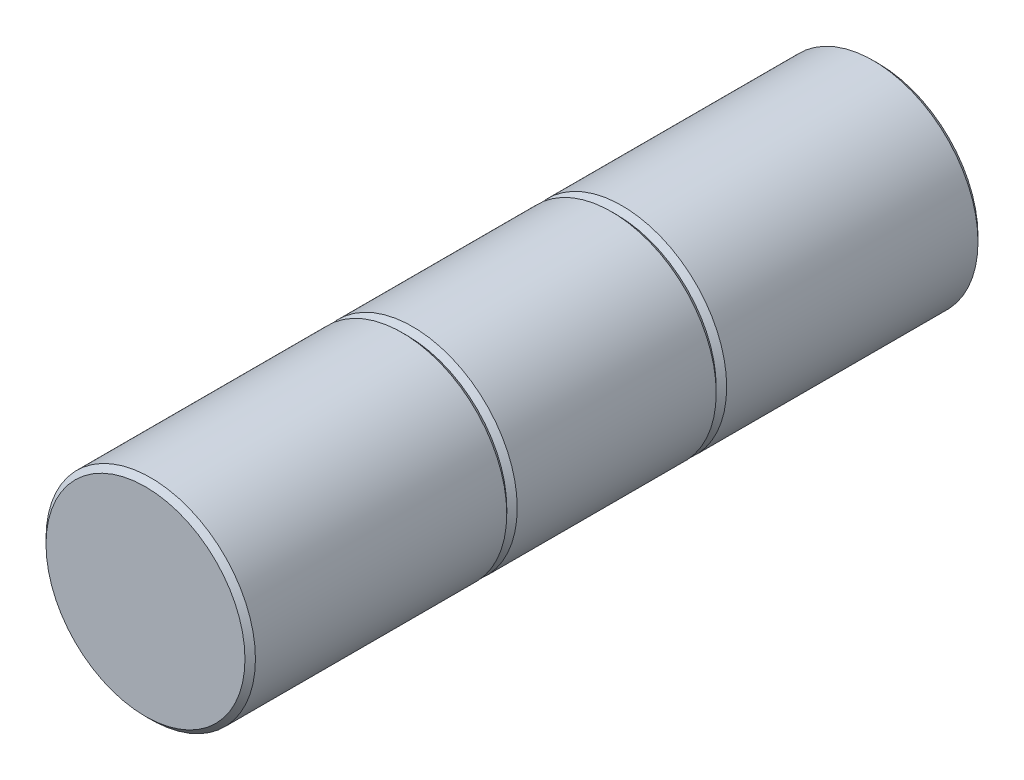
ISO-10303-21;
HEADER;
FILE_DESCRIPTION(('STEP AP214'),'2;1');
FILE_NAME('part.step','',(''),(''),'','','');
FILE_SCHEMA(('AUTOMOTIVE_DESIGN { 1 0 10303 214 1 1 1 1 }'));
ENDSEC;
DATA;
#1=APPLICATION_CONTEXT('core data for automotive mechanical design processes');
#2=APPLICATION_PROTOCOL_DEFINITION('international standard','automotive_design',2000,#1);
#3=PRODUCT_CONTEXT('',#1,'mechanical');
#4=PRODUCT('Part','Part','',(#3));
#5=PRODUCT_RELATED_PRODUCT_CATEGORY('part','',(#4));
#6=PRODUCT_DEFINITION_FORMATION('','',#4);
#7=PRODUCT_DEFINITION_CONTEXT('part definition',#1,'design');
#8=PRODUCT_DEFINITION('design','',#6,#7);
#9=PRODUCT_DEFINITION_SHAPE('','',#8);
#10=(LENGTH_UNIT() NAMED_UNIT(*) SI_UNIT(.MILLI.,.METRE.));
#11=(NAMED_UNIT(*) PLANE_ANGLE_UNIT() SI_UNIT($,.RADIAN.));
#12=(NAMED_UNIT(*) SI_UNIT($,.STERADIAN.) SOLID_ANGLE_UNIT());
#13=UNCERTAINTY_MEASURE_WITH_UNIT(LENGTH_MEASURE(1.E-05),#10,'distance_accuracy_value','');
#14=(GEOMETRIC_REPRESENTATION_CONTEXT(3) GLOBAL_UNCERTAINTY_ASSIGNED_CONTEXT((#13)) GLOBAL_UNIT_ASSIGNED_CONTEXT((#10,
#11,#12)) REPRESENTATION_CONTEXT('',''));
#15=CARTESIAN_POINT('',(0.,0.,0.));
#16=DIRECTION('',(0.,0.,1.));
#17=DIRECTION('',(1.,0.,0.));
#18=AXIS2_PLACEMENT_3D('',#15,#16,#17);
#19=CARTESIAN_POINT('',(0.,0.,-7.));
#20=DIRECTION('',(0.,0.,1.));
#21=DIRECTION('',(1.,0.,0.));
#22=AXIS2_PLACEMENT_3D('',#19,#20,#21);
#23=CYLINDRICAL_SURFACE('',#22,2.);
#24=CARTESIAN_POINT('',(0.,0.,-2.1));
#25=DIRECTION('',(0.,0.,-1.));
#26=DIRECTION('',(-1.,0.,0.));
#27=AXIS2_PLACEMENT_3D('',#24,#25,#26);
#28=CIRCLE('',#27,2.);
#29=CARTESIAN_POINT('',(-2.,0.,-2.1));
#30=VERTEX_POINT('',#29);
#31=EDGE_CURVE('E66',#30,#30,#28,.T.);
#32=ORIENTED_EDGE('',*,*,#31,.T.);
#33=EDGE_LOOP('',(#32));
#34=FACE_BOUND('',#33,.T.);
#35=CARTESIAN_POINT('',(0.,0.,-6.9));
#36=DIRECTION('',(0.,0.,-1.));
#37=DIRECTION('',(-1.,0.,0.));
#38=AXIS2_PLACEMENT_3D('',#35,#36,#37);
#39=CIRCLE('',#38,2.);
#40=CARTESIAN_POINT('',(-2.,0.,-6.9));
#41=VERTEX_POINT('',#40);
#42=EDGE_CURVE('E71',#41,#41,#39,.F.);
#43=ORIENTED_EDGE('',*,*,#42,.T.);
#44=EDGE_LOOP('',(#43));
#45=FACE_BOUND('',#44,.T.);
#46=ADVANCED_FACE('F52',(#34,#45),#23,.T.);
#47=CARTESIAN_POINT('',(0.,0.,-7.));
#48=DIRECTION('',(0.,0.,-1.));
#49=DIRECTION('',(-1.,0.,0.));
#50=AXIS2_PLACEMENT_3D('',#47,#48,#49);
#51=PLANE('',#50);
#52=CARTESIAN_POINT('',(0.,0.,-7.));
#53=DIRECTION('',(0.,0.,-1.));
#54=DIRECTION('',(-1.,0.,0.));
#55=AXIS2_PLACEMENT_3D('',#52,#53,#54);
#56=CIRCLE('',#55,1.9);
#57=CARTESIAN_POINT('',(-1.9,0.,-7.));
#58=VERTEX_POINT('',#57);
#59=EDGE_CURVE('E11',#58,#58,#56,.T.);
#60=ORIENTED_EDGE('',*,*,#59,.T.);
#61=EDGE_LOOP('',(#60));
#62=FACE_BOUND('',#61,.T.);
#63=ADVANCED_FACE('F88',(#62),#51,.T.);
#64=CARTESIAN_POINT('',(0.,0.,-2.));
#65=DIRECTION('',(0.,0.,-1.));
#66=DIRECTION('',(-1.,0.,0.));
#67=AXIS2_PLACEMENT_3D('',#64,#65,#66);
#68=PLANE('',#67);
#69=CARTESIAN_POINT('',(0.,0.,-2.));
#70=DIRECTION('',(0.,0.,-1.));
#71=DIRECTION('',(-1.,0.,0.));
#72=AXIS2_PLACEMENT_3D('',#69,#70,#71);
#73=CIRCLE('',#72,1.9);
#74=CARTESIAN_POINT('',(-1.9,0.,-2.));
#75=VERTEX_POINT('',#74);
#76=EDGE_CURVE('E61',#75,#75,#73,.F.);
#77=ORIENTED_EDGE('',*,*,#76,.T.);
#78=EDGE_LOOP('',(#77));
#79=FACE_BOUND('',#78,.T.);
#80=ADVANCED_FACE('F85',(#79),#68,.F.);
#81=CARTESIAN_POINT('',(0.,0.,-2.1));
#82=DIRECTION('',(0.,0.,-1.));
#83=DIRECTION('',(-1.,0.,0.));
#84=AXIS2_PLACEMENT_3D('',#81,#82,#83);
#85=CONICAL_SURFACE('',#84,2.,0.785398163397453);
#86=ORIENTED_EDGE('',*,*,#76,.F.);
#87=EDGE_LOOP('',(#86));
#88=FACE_BOUND('',#87,.T.);
#89=ORIENTED_EDGE('',*,*,#31,.F.);
#90=EDGE_LOOP('',(#89));
#91=FACE_BOUND('',#90,.T.);
#92=ADVANCED_FACE('F81',(#88,#91),#85,.T.);
#93=CARTESIAN_POINT('',(0.,0.,-7.));
#94=DIRECTION('',(0.,0.,1.));
#95=DIRECTION('',(1.,0.,0.));
#96=AXIS2_PLACEMENT_3D('',#93,#94,#95);
#97=CONICAL_SURFACE('',#96,1.9,0.785398163397444);
#98=ORIENTED_EDGE('',*,*,#42,.F.);
#99=EDGE_LOOP('',(#98));
#100=FACE_BOUND('',#99,.T.);
#101=ORIENTED_EDGE('',*,*,#59,.F.);
#102=EDGE_LOOP('',(#101));
#103=FACE_BOUND('',#102,.T.);
#104=ADVANCED_FACE('F55',(#100,#103),#97,.T.);
#105=CLOSED_SHELL('',(#46,#63,#80,#92,#104));
#106=MANIFOLD_SOLID_BREP('B2',#105);
#107=CARTESIAN_POINT('',(0.,0.,7.));
#108=DIRECTION('',(0.,0.,-1.));
#109=DIRECTION('',(-1.,0.,0.));
#110=AXIS2_PLACEMENT_3D('',#107,#108,#109);
#111=CYLINDRICAL_SURFACE('',#110,2.);
#112=CARTESIAN_POINT('',(0.,0.,2.1));
#113=DIRECTION('',(0.,0.,1.));
#114=DIRECTION('',(1.,0.,0.));
#115=AXIS2_PLACEMENT_3D('',#112,#113,#114);
#116=CIRCLE('',#115,2.);
#117=CARTESIAN_POINT('',(2.,0.,2.1));
#118=VERTEX_POINT('',#117);
#119=EDGE_CURVE('E162',#118,#118,#116,.T.);
#120=ORIENTED_EDGE('',*,*,#119,.T.);
#121=EDGE_LOOP('',(#120));
#122=FACE_BOUND('',#121,.T.);
#123=CARTESIAN_POINT('',(0.,0.,6.9));
#124=DIRECTION('',(0.,0.,1.));
#125=DIRECTION('',(1.,0.,0.));
#126=AXIS2_PLACEMENT_3D('',#123,#124,#125);
#127=CIRCLE('',#126,2.);
#128=CARTESIAN_POINT('',(2.,0.,6.9));
#129=VERTEX_POINT('',#128);
#130=EDGE_CURVE('E166',#129,#129,#127,.F.);
#131=ORIENTED_EDGE('',*,*,#130,.T.);
#132=EDGE_LOOP('',(#131));
#133=FACE_BOUND('',#132,.T.);
#134=ADVANCED_FACE('F150',(#122,#133),#111,.T.);
#135=CARTESIAN_POINT('',(0.,0.,7.));
#136=DIRECTION('',(0.,0.,1.));
#137=DIRECTION('',(1.,0.,0.));
#138=AXIS2_PLACEMENT_3D('',#135,#136,#137);
#139=PLANE('',#138);
#140=CARTESIAN_POINT('',(0.,0.,7.));
#141=DIRECTION('',(0.,0.,1.));
#142=DIRECTION('',(1.,0.,0.));
#143=AXIS2_PLACEMENT_3D('',#140,#141,#142);
#144=CIRCLE('',#143,1.9);
#145=CARTESIAN_POINT('',(1.9,0.,7.));
#146=VERTEX_POINT('',#145);
#147=EDGE_CURVE('E51',#146,#146,#144,.T.);
#148=ORIENTED_EDGE('',*,*,#147,.T.);
#149=EDGE_LOOP('',(#148));
#150=FACE_BOUND('',#149,.T.);
#151=ADVANCED_FACE('F182',(#150),#139,.T.);
#152=CARTESIAN_POINT('',(0.,0.,2.));
#153=DIRECTION('',(0.,0.,1.));
#154=DIRECTION('',(1.,0.,0.));
#155=AXIS2_PLACEMENT_3D('',#152,#153,#154);
#156=PLANE('',#155);
#157=CARTESIAN_POINT('',(0.,0.,2.));
#158=DIRECTION('',(0.,0.,1.));
#159=DIRECTION('',(1.,0.,0.));
#160=AXIS2_PLACEMENT_3D('',#157,#158,#159);
#161=CIRCLE('',#160,1.9);
#162=CARTESIAN_POINT('',(1.9,0.,2.));
#163=VERTEX_POINT('',#162);
#164=EDGE_CURVE('E158',#163,#163,#161,.F.);
#165=ORIENTED_EDGE('',*,*,#164,.T.);
#166=EDGE_LOOP('',(#165));
#167=FACE_BOUND('',#166,.T.);
#168=ADVANCED_FACE('F179',(#167),#156,.F.);
#169=CARTESIAN_POINT('',(0.,0.,2.1));
#170=DIRECTION('',(0.,0.,1.));
#171=DIRECTION('',(1.,0.,0.));
#172=AXIS2_PLACEMENT_3D('',#169,#170,#171);
#173=CONICAL_SURFACE('',#172,2.,0.785398163397453);
#174=ORIENTED_EDGE('',*,*,#164,.F.);
#175=EDGE_LOOP('',(#174));
#176=FACE_BOUND('',#175,.T.);
#177=ORIENTED_EDGE('',*,*,#119,.F.);
#178=EDGE_LOOP('',(#177));
#179=FACE_BOUND('',#178,.T.);
#180=ADVANCED_FACE('F175',(#176,#179),#173,.T.);
#181=CARTESIAN_POINT('',(0.,0.,7.));
#182=DIRECTION('',(0.,0.,-1.));
#183=DIRECTION('',(-1.,0.,0.));
#184=AXIS2_PLACEMENT_3D('',#181,#182,#183);
#185=CONICAL_SURFACE('',#184,1.9,0.785398163397444);
#186=ORIENTED_EDGE('',*,*,#130,.F.);
#187=EDGE_LOOP('',(#186));
#188=FACE_BOUND('',#187,.T.);
#189=ORIENTED_EDGE('',*,*,#147,.F.);
#190=EDGE_LOOP('',(#189));
#191=FACE_BOUND('',#190,.T.);
#192=ADVANCED_FACE('F153',(#188,#191),#185,.T.);
#193=CLOSED_SHELL('',(#134,#151,#168,#180,#192));
#194=MANIFOLD_SOLID_BREP('B6',#193);
#195=CARTESIAN_POINT('',(0.,0.,2.));
#196=DIRECTION('',(0.,0.,-1.));
#197=DIRECTION('',(-1.,0.,0.));
#198=AXIS2_PLACEMENT_3D('',#195,#196,#197);
#199=CYLINDRICAL_SURFACE('',#198,2.);
#200=CARTESIAN_POINT('',(0.,0.,-1.9));
#201=DIRECTION('',(0.,0.,1.));
#202=DIRECTION('',(1.,0.,0.));
#203=AXIS2_PLACEMENT_3D('',#200,#201,#202);
#204=CIRCLE('',#203,2.);
#205=CARTESIAN_POINT('',(2.,0.,-1.9));
#206=VERTEX_POINT('',#205);
#207=EDGE_CURVE('E249',#206,#206,#204,.T.);
#208=ORIENTED_EDGE('',*,*,#207,.T.);
#209=EDGE_LOOP('',(#208));
#210=FACE_BOUND('',#209,.T.);
#211=CARTESIAN_POINT('',(0.,0.,1.9));
#212=DIRECTION('',(0.,0.,1.));
#213=DIRECTION('',(1.,0.,0.));
#214=AXIS2_PLACEMENT_3D('',#211,#212,#213);
#215=CIRCLE('',#214,2.);
#216=CARTESIAN_POINT('',(2.,0.,1.9));
#217=VERTEX_POINT('',#216);
#218=EDGE_CURVE('E253',#217,#217,#215,.F.);
#219=ORIENTED_EDGE('',*,*,#218,.T.);
#220=EDGE_LOOP('',(#219));
#221=FACE_BOUND('',#220,.T.);
#222=ADVANCED_FACE('F237',(#210,#221),#199,.T.);
#223=CARTESIAN_POINT('',(0.,0.,2.));
#224=DIRECTION('',(0.,0.,1.));
#225=DIRECTION('',(1.,0.,0.));
#226=AXIS2_PLACEMENT_3D('',#223,#224,#225);
#227=PLANE('',#226);
#228=CARTESIAN_POINT('',(0.,0.,2.));
#229=DIRECTION('',(0.,0.,1.));
#230=DIRECTION('',(1.,0.,0.));
#231=AXIS2_PLACEMENT_3D('',#228,#229,#230);
#232=CIRCLE('',#231,1.9);
#233=CARTESIAN_POINT('',(1.9,0.,2.));
#234=VERTEX_POINT('',#233);
#235=EDGE_CURVE('E149',#234,#234,#232,.T.);
#236=ORIENTED_EDGE('',*,*,#235,.T.);
#237=EDGE_LOOP('',(#236));
#238=FACE_BOUND('',#237,.T.);
#239=ADVANCED_FACE('F269',(#238),#227,.T.);
#240=CARTESIAN_POINT('',(0.,0.,-2.));
#241=DIRECTION('',(0.,0.,1.));
#242=DIRECTION('',(1.,0.,0.));
#243=AXIS2_PLACEMENT_3D('',#240,#241,#242);
#244=PLANE('',#243);
#245=CARTESIAN_POINT('',(0.,0.,-2.));
#246=DIRECTION('',(0.,0.,1.));
#247=DIRECTION('',(1.,0.,0.));
#248=AXIS2_PLACEMENT_3D('',#245,#246,#247);
#249=CIRCLE('',#248,1.9);
#250=CARTESIAN_POINT('',(1.9,0.,-2.));
#251=VERTEX_POINT('',#250);
#252=EDGE_CURVE('E245',#251,#251,#249,.F.);
#253=ORIENTED_EDGE('',*,*,#252,.T.);
#254=EDGE_LOOP('',(#253));
#255=FACE_BOUND('',#254,.T.);
#256=ADVANCED_FACE('F266',(#255),#244,.F.);
#257=CARTESIAN_POINT('',(0.,0.,-1.9));
#258=DIRECTION('',(0.,0.,1.));
#259=DIRECTION('',(1.,0.,0.));
#260=AXIS2_PLACEMENT_3D('',#257,#258,#259);
#261=CONICAL_SURFACE('',#260,2.,0.785398163397453);
#262=CARTESIAN_POINT('',(1.9,0.,-2.));
#263=CARTESIAN_POINT('',(1.90104166666667,0.,-1.99895833333333));
#264=CARTESIAN_POINT('',(1.90208333333333,0.,-1.99791666666667));
#265=CARTESIAN_POINT('',(1.90416666666667,0.,-1.99583333333333));
#266=CARTESIAN_POINT('',(1.90520833333333,0.,-1.99479166666667));
#267=CARTESIAN_POINT('',(1.90729166666667,0.,-1.99270833333333));
#268=CARTESIAN_POINT('',(1.90833333333333,0.,-1.99166666666667));
#269=CARTESIAN_POINT('',(1.91041666666667,0.,-1.98958333333333));
#270=CARTESIAN_POINT('',(1.91145833333333,0.,-1.98854166666667));
#271=CARTESIAN_POINT('',(1.91354166666667,0.,-1.98645833333333));
#272=CARTESIAN_POINT('',(1.91458333333333,0.,-1.98541666666667));
#273=CARTESIAN_POINT('',(1.91666666666667,0.,-1.98333333333333));
#274=CARTESIAN_POINT('',(1.91770833333333,0.,-1.98229166666667));
#275=CARTESIAN_POINT('',(1.91979166666667,0.,-1.98020833333333));
#276=CARTESIAN_POINT('',(1.92083333333333,0.,-1.97916666666667));
#277=CARTESIAN_POINT('',(1.92291666666667,0.,-1.97708333333333));
#278=CARTESIAN_POINT('',(1.92395833333333,0.,-1.97604166666667));
#279=CARTESIAN_POINT('',(1.92604166666667,0.,-1.97395833333333));
#280=CARTESIAN_POINT('',(1.92708333333333,0.,-1.97291666666667));
#281=CARTESIAN_POINT('',(1.92916666666667,0.,-1.97083333333333));
#282=CARTESIAN_POINT('',(1.93020833333333,0.,-1.96979166666667));
#283=CARTESIAN_POINT('',(1.93229166666667,0.,-1.96770833333333));
#284=CARTESIAN_POINT('',(1.93333333333333,0.,-1.96666666666667));
#285=CARTESIAN_POINT('',(1.93541666666667,0.,-1.96458333333333));
#286=CARTESIAN_POINT('',(1.93645833333333,0.,-1.96354166666667));
#287=CARTESIAN_POINT('',(1.93854166666667,0.,-1.96145833333333));
#288=CARTESIAN_POINT('',(1.93958333333333,0.,-1.96041666666667));
#289=CARTESIAN_POINT('',(1.94166666666667,0.,-1.95833333333333));
#290=CARTESIAN_POINT('',(1.94270833333333,0.,-1.95729166666667));
#291=CARTESIAN_POINT('',(1.94479166666667,0.,-1.95520833333333));
#292=CARTESIAN_POINT('',(1.94583333333333,0.,-1.95416666666667));
#293=CARTESIAN_POINT('',(1.94791666666667,0.,-1.95208333333333));
#294=CARTESIAN_POINT('',(1.94895833333333,0.,-1.95104166666667));
#295=CARTESIAN_POINT('',(1.95104166666667,0.,-1.94895833333333));
#296=CARTESIAN_POINT('',(1.95208333333333,0.,-1.94791666666667));
#297=CARTESIAN_POINT('',(1.95416666666667,0.,-1.94583333333333));
#298=CARTESIAN_POINT('',(1.95520833333333,0.,-1.94479166666667));
#299=CARTESIAN_POINT('',(1.95729166666667,0.,-1.94270833333333));
#300=CARTESIAN_POINT('',(1.95833333333333,0.,-1.94166666666667));
#301=CARTESIAN_POINT('',(1.96041666666667,0.,-1.93958333333333));
#302=CARTESIAN_POINT('',(1.96145833333333,0.,-1.93854166666667));
#303=CARTESIAN_POINT('',(1.96354166666667,0.,-1.93645833333333));
#304=CARTESIAN_POINT('',(1.96458333333333,0.,-1.93541666666667));
#305=CARTESIAN_POINT('',(1.96666666666667,0.,-1.93333333333333));
#306=CARTESIAN_POINT('',(1.96770833333333,0.,-1.93229166666667));
#307=CARTESIAN_POINT('',(1.96979166666667,0.,-1.93020833333333));
#308=CARTESIAN_POINT('',(1.97083333333333,0.,-1.92916666666667));
#309=CARTESIAN_POINT('',(1.97291666666667,0.,-1.92708333333333));
#310=CARTESIAN_POINT('',(1.97395833333333,0.,-1.92604166666667));
#311=CARTESIAN_POINT('',(1.97604166666667,0.,-1.92395833333333));
#312=CARTESIAN_POINT('',(1.97708333333333,0.,-1.92291666666667));
#313=CARTESIAN_POINT('',(1.97916666666667,0.,-1.92083333333333));
#314=CARTESIAN_POINT('',(1.98020833333333,0.,-1.91979166666667));
#315=CARTESIAN_POINT('',(1.98229166666667,0.,-1.91770833333333));
#316=CARTESIAN_POINT('',(1.98333333333333,0.,-1.91666666666667));
#317=CARTESIAN_POINT('',(1.98541666666667,0.,-1.91458333333333));
#318=CARTESIAN_POINT('',(1.98645833333333,0.,-1.91354166666667));
#319=CARTESIAN_POINT('',(1.98854166666667,0.,-1.91145833333333));
#320=CARTESIAN_POINT('',(1.98958333333333,0.,-1.91041666666667));
#321=CARTESIAN_POINT('',(1.99166666666667,0.,-1.90833333333333));
#322=CARTESIAN_POINT('',(1.99270833333333,0.,-1.90729166666667));
#323=CARTESIAN_POINT('',(1.99479166666667,0.,-1.90520833333333));
#324=CARTESIAN_POINT('',(1.99583333333333,0.,-1.90416666666667));
#325=CARTESIAN_POINT('',(1.99791666666667,0.,-1.90208333333333));
#326=CARTESIAN_POINT('',(1.99895833333333,0.,-1.90104166666667));
#327=CARTESIAN_POINT('',(2.,0.,-1.9));
#328=B_SPLINE_CURVE_WITH_KNOTS('',3,(#262,#263,#264,#265,#266,#267,#268,#269,#270,#271,#272,
#273,#274,#275,#276,#277,#278,#279,#280,#281,#282,#283,#284,#285,#286,#287,#288,#289,#290,#291,
#292,#293,#294,#295,#296,#297,#298,#299,#300,#301,#302,#303,#304,#305,#306,#307,#308,#309,#310,
#311,#312,#313,#314,#315,#316,#317,#318,#319,#320,#321,#322,#323,#324,#325,#326,#327),
.UNSPECIFIED.,.F.,.F.,(4,2,2,2,2,2,2,2,2,2,2,2,2,2,2,2,2,2,2,2,2,2,2,2,2,2,2,2,2,2,2,2,4),(0.,
0.0044194173824159,0.00883883476483194,0.013258252147248,0.017677669529664,0.0220970869120796,
0.0265165042944957,0.0309359216769117,0.0353553390593276,0.0397747564417437,0.0441941738241594,
0.0486135912065755,0.0530330085889914,0.0574524259714074,0.0618718433538235,0.066291260736239,
0.0707106781186551,0.0751300955010711,0.0795495128834871,0.0839689302659031,0.0883883476483188,
0.0928077650307347,0.0972271824131508,0.101646599795567,0.106066017177983,0.110485434560399,
0.114904851942815,0.11932426932523,0.123743686707646,0.128163104090062,0.132582521472478,
0.137001938854894,0.14142135623731),.UNSPECIFIED.);
#329=EDGE_CURVE('BSEAM262',#251,#206,#328,.T.);
#330=ORIENTED_EDGE('',*,*,#252,.F.);
#331=ORIENTED_EDGE('',*,*,#207,.F.);
#332=ORIENTED_EDGE('',*,*,#329,.T.);
#333=ORIENTED_EDGE('',*,*,#329,.F.);
#334=EDGE_LOOP('',(#330,#332,#331,#333));
#335=FACE_BOUND('',#334,.T.);
#336=ADVANCED_FACE('F262',(#335),#261,.T.);
#337=CARTESIAN_POINT('',(0.,0.,2.));
#338=DIRECTION('',(0.,0.,-1.));
#339=DIRECTION('',(-1.,0.,0.));
#340=AXIS2_PLACEMENT_3D('',#337,#338,#339);
#341=CONICAL_SURFACE('',#340,1.9,0.785398163397444);
#342=ORIENTED_EDGE('',*,*,#218,.F.);
#343=EDGE_LOOP('',(#342));
#344=FACE_BOUND('',#343,.T.);
#345=ORIENTED_EDGE('',*,*,#235,.F.);
#346=EDGE_LOOP('',(#345));
#347=FACE_BOUND('',#346,.T.);
#348=ADVANCED_FACE('F240',(#344,#347),#341,.T.);
#349=CLOSED_SHELL('',(#222,#239,#256,#336,#348));
#350=MANIFOLD_SOLID_BREP('B46',#349);
#351=ADVANCED_BREP_SHAPE_REPRESENTATION('',(#18,#106,#194,#350),#14);
#352=SHAPE_DEFINITION_REPRESENTATION(#9,#351);
ENDSEC;
END-ISO-10303-21;
